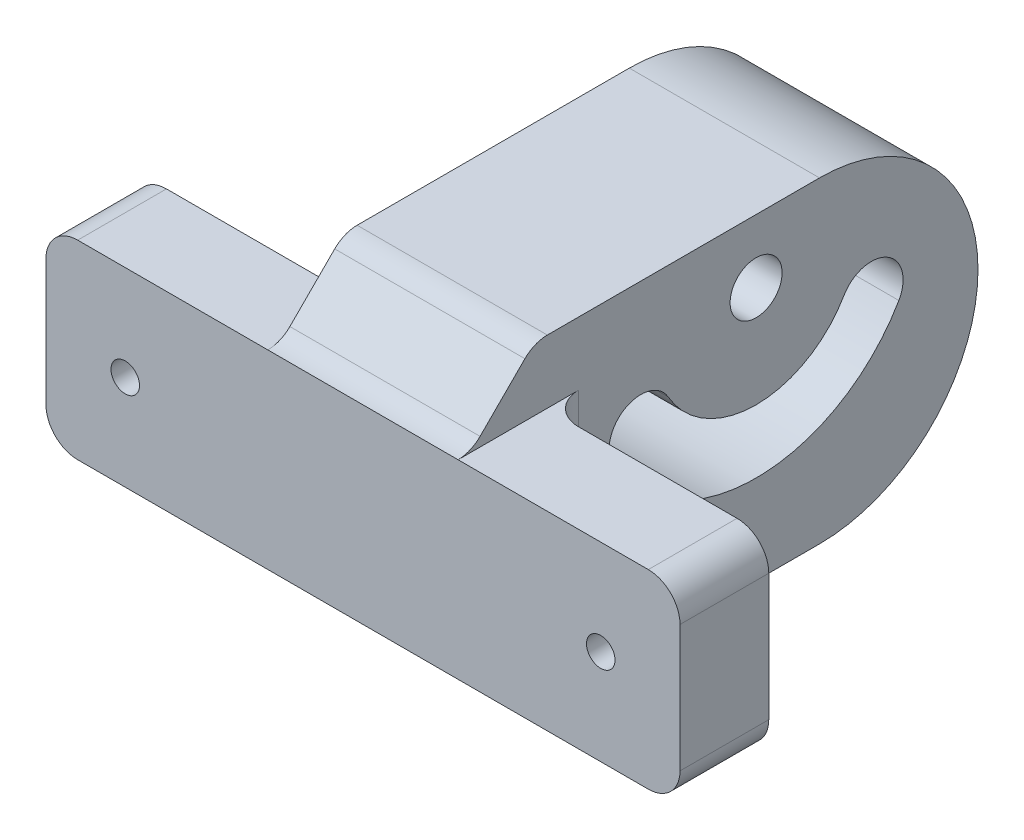
ISO-10303-21;
HEADER;
FILE_DESCRIPTION(('STEP AP214'),'2;1');
FILE_NAME('part.step','',(''),(''),'','','');
FILE_SCHEMA(('AUTOMOTIVE_DESIGN { 1 0 10303 214 1 1 1 1 }'));
ENDSEC;
DATA;
#1=APPLICATION_CONTEXT('core data for automotive mechanical design processes');
#2=APPLICATION_PROTOCOL_DEFINITION('international standard','automotive_design',2000,#1);
#3=PRODUCT_CONTEXT('',#1,'mechanical');
#4=PRODUCT('Part','Part','',(#3));
#5=PRODUCT_RELATED_PRODUCT_CATEGORY('part','',(#4));
#6=PRODUCT_DEFINITION_FORMATION('','',#4);
#7=PRODUCT_DEFINITION_CONTEXT('part definition',#1,'design');
#8=PRODUCT_DEFINITION('design','',#6,#7);
#9=PRODUCT_DEFINITION_SHAPE('','',#8);
#10=(LENGTH_UNIT() NAMED_UNIT(*) SI_UNIT(.MILLI.,.METRE.));
#11=(NAMED_UNIT(*) PLANE_ANGLE_UNIT() SI_UNIT($,.RADIAN.));
#12=(NAMED_UNIT(*) SI_UNIT($,.STERADIAN.) SOLID_ANGLE_UNIT());
#13=UNCERTAINTY_MEASURE_WITH_UNIT(LENGTH_MEASURE(1.E-05),#10,'distance_accuracy_value','');
#14=(GEOMETRIC_REPRESENTATION_CONTEXT(3) GLOBAL_UNCERTAINTY_ASSIGNED_CONTEXT((#13)) GLOBAL_UNIT_ASSIGNED_CONTEXT((#10,
#11,#12)) REPRESENTATION_CONTEXT('',''));
#15=CARTESIAN_POINT('',(0.,0.,0.));
#16=DIRECTION('',(0.,0.,1.));
#17=DIRECTION('',(1.,0.,0.));
#18=AXIS2_PLACEMENT_3D('',#15,#16,#17);
#19=CARTESIAN_POINT('',(50.,-44.,-21.));
#20=DIRECTION('',(0.,1.,0.));
#21=DIRECTION('',(-1.,0.,0.));
#22=AXIS2_PLACEMENT_3D('',#19,#20,#21);
#23=PLANE('',#22);
#24=DIRECTION('',(-1.,0.,0.));
#25=VECTOR('',#24,1.);
#26=CARTESIAN_POINT('',(50.,-44.,-7.));
#27=LINE('',#26,#25);
#28=CARTESIAN_POINT('',(-15.,-44.,-7.));
#29=VERTEX_POINT('',#28);
#30=CARTESIAN_POINT('',(-45.,-44.,-7.));
#31=VERTEX_POINT('',#30);
#32=EDGE_CURVE('E324',#29,#31,#27,.T.);
#33=ORIENTED_EDGE('',*,*,#32,.T.);
#34=DIRECTION('',(0.,0.,1.));
#35=VECTOR('',#34,1.);
#36=CARTESIAN_POINT('',(-45.,-44.,-21.));
#37=LINE('',#36,#35);
#38=CARTESIAN_POINT('',(-45.,-44.,-21.));
#39=VERTEX_POINT('',#38);
#40=EDGE_CURVE('E419',#31,#39,#37,.F.);
#41=ORIENTED_EDGE('',*,*,#40,.T.);
#42=DIRECTION('',(-1.,0.,0.));
#43=VECTOR('',#42,1.);
#44=CARTESIAN_POINT('',(50.,-44.,-21.));
#45=LINE('',#44,#43);
#46=CARTESIAN_POINT('',(-20.,-44.,-21.));
#47=VERTEX_POINT('',#46);
#48=EDGE_CURVE('E311',#47,#39,#45,.T.);
#49=ORIENTED_EDGE('',*,*,#48,.F.);
#50=CARTESIAN_POINT('',(-20.,-44.,-26.));
#51=DIRECTION('',(0.,1.,0.));
#52=DIRECTION('',(-1.,0.,0.));
#53=AXIS2_PLACEMENT_3D('',#50,#51,#52);
#54=CIRCLE('',#53,5.);
#55=CARTESIAN_POINT('',(-15.,-44.,-26.));
#56=VERTEX_POINT('',#55);
#57=EDGE_CURVE('E444',#47,#56,#54,.T.);
#58=ORIENTED_EDGE('',*,*,#57,.T.);
#59=DIRECTION('',(0.,0.,-1.));
#60=VECTOR('',#59,1.);
#61=CARTESIAN_POINT('',(-15.,-44.,-21.));
#62=LINE('',#61,#60);
#63=EDGE_CURVE('E281',#29,#56,#62,.T.);
#64=ORIENTED_EDGE('',*,*,#63,.F.);
#65=EDGE_LOOP('',(#33,#41,#49,#58,#64));
#66=FACE_BOUND('',#65,.T.);
#67=ADVANCED_FACE('F39',(#66),#23,.F.);
#68=CARTESIAN_POINT('',(50.,-14.,-21.));
#69=DIRECTION('',(0.,-1.,0.));
#70=DIRECTION('',(1.,0.,0.));
#71=AXIS2_PLACEMENT_3D('',#68,#69,#70);
#72=PLANE('',#71);
#73=DIRECTION('',(1.,0.,0.));
#74=VECTOR('',#73,1.);
#75=CARTESIAN_POINT('',(50.,-14.,-21.));
#76=LINE('',#75,#74);
#77=CARTESIAN_POINT('',(-45.,-14.,-21.));
#78=VERTEX_POINT('',#77);
#79=CARTESIAN_POINT('',(-20.,-14.,-21.));
#80=VERTEX_POINT('',#79);
#81=EDGE_CURVE('E318',#78,#80,#76,.T.);
#82=ORIENTED_EDGE('',*,*,#81,.F.);
#83=DIRECTION('',(0.,0.,1.));
#84=VECTOR('',#83,1.);
#85=CARTESIAN_POINT('',(-45.,-14.,-21.));
#86=LINE('',#85,#84);
#87=CARTESIAN_POINT('',(-45.,-14.,-7.));
#88=VERTEX_POINT('',#87);
#89=EDGE_CURVE('E408',#78,#88,#86,.T.);
#90=ORIENTED_EDGE('',*,*,#89,.T.);
#91=DIRECTION('',(1.,0.,0.));
#92=VECTOR('',#91,1.);
#93=CARTESIAN_POINT('',(50.,-14.,-7.));
#94=LINE('',#93,#92);
#95=CARTESIAN_POINT('',(-15.,-14.,-7.));
#96=VERTEX_POINT('',#95);
#97=EDGE_CURVE('E312',#88,#96,#94,.T.);
#98=ORIENTED_EDGE('',*,*,#97,.T.);
#99=DIRECTION('',(0.,0.,1.));
#100=VECTOR('',#99,1.);
#101=CARTESIAN_POINT('',(-15.,-14.,-21.));
#102=LINE('',#101,#100);
#103=CARTESIAN_POINT('',(-15.,-14.,-26.));
#104=VERTEX_POINT('',#103);
#105=EDGE_CURVE('E270',#104,#96,#102,.T.);
#106=ORIENTED_EDGE('',*,*,#105,.F.);
#107=CARTESIAN_POINT('',(-20.,-14.,-26.));
#108=DIRECTION('',(0.,-1.,0.));
#109=DIRECTION('',(1.,0.,0.));
#110=AXIS2_PLACEMENT_3D('',#107,#108,#109);
#111=CIRCLE('',#110,5.);
#112=EDGE_CURVE('E447',#104,#80,#111,.T.);
#113=ORIENTED_EDGE('',*,*,#112,.T.);
#114=EDGE_LOOP('',(#82,#90,#98,#106,#113));
#115=FACE_BOUND('',#114,.T.);
#116=ADVANCED_FACE('F539',(#115),#72,.F.);
#117=CARTESIAN_POINT('',(0.,0.,-21.));
#118=DIRECTION('',(0.,0.,-1.));
#119=DIRECTION('',(-1.,0.,0.));
#120=AXIS2_PLACEMENT_3D('',#117,#118,#119);
#121=PLANE('',#120);
#122=CARTESIAN_POINT('',(-37.5,-29.,-21.));
#123=DIRECTION('',(0.,0.,-1.));
#124=DIRECTION('',(-1.,0.,0.));
#125=AXIS2_PLACEMENT_3D('',#122,#123,#124);
#126=CIRCLE('',#125,4.5);
#127=CARTESIAN_POINT('',(-42.,-29.,-21.));
#128=VERTEX_POINT('',#127);
#129=EDGE_CURVE('E295',#128,#128,#126,.T.);
#130=ORIENTED_EDGE('',*,*,#129,.F.);
#131=EDGE_LOOP('',(#130));
#132=FACE_BOUND('',#131,.T.);
#133=ORIENTED_EDGE('',*,*,#48,.T.);
#134=CARTESIAN_POINT('',(-45.,-39.,-21.));
#135=DIRECTION('',(0.,0.,-1.));
#136=DIRECTION('',(-1.,0.,0.));
#137=AXIS2_PLACEMENT_3D('',#134,#135,#136);
#138=CIRCLE('',#137,5.);
#139=CARTESIAN_POINT('',(-50.,-39.,-21.));
#140=VERTEX_POINT('',#139);
#141=EDGE_CURVE('E61',#39,#140,#138,.T.);
#142=ORIENTED_EDGE('',*,*,#141,.T.);
#143=DIRECTION('',(0.,1.,0.));
#144=VECTOR('',#143,1.);
#145=CARTESIAN_POINT('',(-50.,-14.,-21.));
#146=LINE('',#145,#144);
#147=CARTESIAN_POINT('',(-50.,-19.,-21.));
#148=VERTEX_POINT('',#147);
#149=EDGE_CURVE('E315',#140,#148,#146,.T.);
#150=ORIENTED_EDGE('',*,*,#149,.T.);
#151=CARTESIAN_POINT('',(-45.,-19.,-21.));
#152=DIRECTION('',(0.,0.,-1.));
#153=DIRECTION('',(-1.,0.,0.));
#154=AXIS2_PLACEMENT_3D('',#151,#152,#153);
#155=CIRCLE('',#154,5.);
#156=EDGE_CURVE('E431',#148,#78,#155,.T.);
#157=ORIENTED_EDGE('',*,*,#156,.T.);
#158=ORIENTED_EDGE('',*,*,#81,.T.);
#159=DIRECTION('',(0.,-1.,0.));
#160=VECTOR('',#159,1.);
#161=CARTESIAN_POINT('',(-20.,0.,-21.));
#162=LINE('',#161,#160);
#163=EDGE_CURVE('E428',#80,#47,#162,.T.);
#164=ORIENTED_EDGE('',*,*,#163,.T.);
#165=EDGE_LOOP('',(#133,#142,#150,#157,#158,#164));
#166=FACE_BOUND('',#165,.T.);
#167=ADVANCED_FACE('F558',(#132,#166),#121,.T.);
#168=CARTESIAN_POINT('',(-37.5,-29.,-0.636038969321066));
#169=DIRECTION('',(0.,0.,-1.));
#170=DIRECTION('',(-1.,0.,0.));
#171=AXIS2_PLACEMENT_3D('',#168,#169,#170);
#172=CYLINDRICAL_SURFACE('',#171,2.25);
#173=CARTESIAN_POINT('',(-37.5,-29.,-7.));
#174=DIRECTION('',(0.,0.,-1.));
#175=DIRECTION('',(-1.,0.,0.));
#176=AXIS2_PLACEMENT_3D('',#173,#174,#175);
#177=CIRCLE('',#176,2.25);
#178=CARTESIAN_POINT('',(-39.75,-29.,-7.));
#179=VERTEX_POINT('',#178);
#180=EDGE_CURVE('E304',#179,#179,#177,.F.);
#181=ORIENTED_EDGE('',*,*,#180,.T.);
#182=EDGE_LOOP('',(#181));
#183=FACE_BOUND('',#182,.T.);
#184=CARTESIAN_POINT('',(-37.5,-29.,-16.6));
#185=DIRECTION('',(0.,0.,-1.));
#186=DIRECTION('',(-1.,0.,0.));
#187=AXIS2_PLACEMENT_3D('',#184,#185,#186);
#188=CIRCLE('',#187,2.25);
#189=CARTESIAN_POINT('',(-39.75,-29.,-16.6));
#190=VERTEX_POINT('',#189);
#191=EDGE_CURVE('E307',#190,#190,#188,.F.);
#192=ORIENTED_EDGE('',*,*,#191,.F.);
#193=EDGE_LOOP('',(#192));
#194=FACE_BOUND('',#193,.T.);
#195=ADVANCED_FACE('F560',(#183,#194),#172,.F.);
#196=CARTESIAN_POINT('',(37.5,-29.,-0.636038969321066));
#197=DIRECTION('',(0.,0.,-1.));
#198=DIRECTION('',(-1.,0.,0.));
#199=AXIS2_PLACEMENT_3D('',#196,#197,#198);
#200=CYLINDRICAL_SURFACE('',#199,2.25);
#201=CARTESIAN_POINT('',(37.5,-29.,-7.));
#202=DIRECTION('',(0.,0.,-1.));
#203=DIRECTION('',(-1.,0.,0.));
#204=AXIS2_PLACEMENT_3D('',#201,#202,#203);
#205=CIRCLE('',#204,2.25);
#206=CARTESIAN_POINT('',(35.25,-29.,-7.));
#207=VERTEX_POINT('',#206);
#208=EDGE_CURVE('E300',#207,#207,#205,.F.);
#209=ORIENTED_EDGE('',*,*,#208,.T.);
#210=EDGE_LOOP('',(#209));
#211=FACE_BOUND('',#210,.T.);
#212=CARTESIAN_POINT('',(37.5,-29.,-16.6));
#213=DIRECTION('',(0.,0.,-1.));
#214=DIRECTION('',(-1.,0.,0.));
#215=AXIS2_PLACEMENT_3D('',#212,#213,#214);
#216=CIRCLE('',#215,2.25);
#217=CARTESIAN_POINT('',(35.25,-29.,-16.6));
#218=VERTEX_POINT('',#217);
#219=EDGE_CURVE('E291',#218,#218,#216,.F.);
#220=ORIENTED_EDGE('',*,*,#219,.F.);
#221=EDGE_LOOP('',(#220));
#222=FACE_BOUND('',#221,.T.);
#223=ADVANCED_FACE('F568',(#211,#222),#200,.F.);
#224=CARTESIAN_POINT('',(50.,-14.,-21.));
#225=DIRECTION('',(-1.,0.,0.));
#226=DIRECTION('',(0.,-1.,0.));
#227=AXIS2_PLACEMENT_3D('',#224,#225,#226);
#228=PLANE('',#227);
#229=DIRECTION('',(0.,-1.,0.));
#230=VECTOR('',#229,1.);
#231=CARTESIAN_POINT('',(50.,-14.,-21.));
#232=LINE('',#231,#230);
#233=CARTESIAN_POINT('',(50.,-19.,-21.));
#234=VERTEX_POINT('',#233);
#235=CARTESIAN_POINT('',(50.,-39.,-21.));
#236=VERTEX_POINT('',#235);
#237=EDGE_CURVE('E308',#234,#236,#232,.T.);
#238=ORIENTED_EDGE('',*,*,#237,.F.);
#239=DIRECTION('',(0.,0.,1.));
#240=VECTOR('',#239,1.);
#241=CARTESIAN_POINT('',(50.,-19.,-21.));
#242=LINE('',#241,#240);
#243=CARTESIAN_POINT('',(50.,-19.,-7.));
#244=VERTEX_POINT('',#243);
#245=EDGE_CURVE('E397',#234,#244,#242,.T.);
#246=ORIENTED_EDGE('',*,*,#245,.T.);
#247=DIRECTION('',(0.,-1.,0.));
#248=VECTOR('',#247,1.);
#249=CARTESIAN_POINT('',(50.,-14.,-7.));
#250=LINE('',#249,#248);
#251=CARTESIAN_POINT('',(50.,-39.,-7.));
#252=VERTEX_POINT('',#251);
#253=EDGE_CURVE('E303',#244,#252,#250,.T.);
#254=ORIENTED_EDGE('',*,*,#253,.T.);
#255=DIRECTION('',(0.,0.,1.));
#256=VECTOR('',#255,1.);
#257=CARTESIAN_POINT('',(50.,-39.,-21.));
#258=LINE('',#257,#256);
#259=EDGE_CURVE('E395',#252,#236,#258,.F.);
#260=ORIENTED_EDGE('',*,*,#259,.T.);
#261=EDGE_LOOP('',(#238,#246,#254,#260));
#262=FACE_BOUND('',#261,.T.);
#263=ADVANCED_FACE('F475',(#262),#228,.F.);
#264=CARTESIAN_POINT('',(45.,-44.,-21.));
#265=VERTEX_POINT('',#264);
#266=CARTESIAN_POINT('',(20.,-44.,-21.));
#267=VERTEX_POINT('',#266);
#268=EDGE_CURVE('E314',#265,#267,#45,.T.);
#269=ORIENTED_EDGE('',*,*,#268,.F.);
#270=DIRECTION('',(0.,0.,1.));
#271=VECTOR('',#270,1.);
#272=CARTESIAN_POINT('',(45.,-44.,-21.));
#273=LINE('',#272,#271);
#274=CARTESIAN_POINT('',(45.,-44.,-7.));
#275=VERTEX_POINT('',#274);
#276=EDGE_CURVE('E421',#265,#275,#273,.T.);
#277=ORIENTED_EDGE('',*,*,#276,.T.);
#278=CARTESIAN_POINT('',(15.,-44.,-7.));
#279=VERTEX_POINT('',#278);
#280=EDGE_CURVE('E328',#275,#279,#27,.T.);
#281=ORIENTED_EDGE('',*,*,#280,.T.);
#282=DIRECTION('',(0.,0.,-1.));
#283=VECTOR('',#282,1.);
#284=CARTESIAN_POINT('',(15.,-44.,-21.));
#285=LINE('',#284,#283);
#286=CARTESIAN_POINT('',(15.,-44.,-26.));
#287=VERTEX_POINT('',#286);
#288=EDGE_CURVE('E285',#279,#287,#285,.T.);
#289=ORIENTED_EDGE('',*,*,#288,.T.);
#290=CARTESIAN_POINT('',(20.,-44.,-26.));
#291=DIRECTION('',(0.,1.,0.));
#292=DIRECTION('',(-1.,0.,0.));
#293=AXIS2_PLACEMENT_3D('',#290,#291,#292);
#294=CIRCLE('',#293,5.);
#295=EDGE_CURVE('E47',#287,#267,#294,.T.);
#296=ORIENTED_EDGE('',*,*,#295,.T.);
#297=EDGE_LOOP('',(#269,#277,#281,#289,#296));
#298=FACE_BOUND('',#297,.T.);
#299=ADVANCED_FACE('F452',(#298),#23,.F.);
#300=CARTESIAN_POINT('',(-50.,-14.,-21.));
#301=DIRECTION('',(1.,0.,0.));
#302=DIRECTION('',(0.,0.,-1.));
#303=AXIS2_PLACEMENT_3D('',#300,#301,#302);
#304=PLANE('',#303);
#305=ORIENTED_EDGE('',*,*,#149,.F.);
#306=DIRECTION('',(0.,0.,1.));
#307=VECTOR('',#306,1.);
#308=CARTESIAN_POINT('',(-50.,-39.,-21.));
#309=LINE('',#308,#307);
#310=CARTESIAN_POINT('',(-50.,-39.,-7.));
#311=VERTEX_POINT('',#310);
#312=EDGE_CURVE('E425',#140,#311,#309,.T.);
#313=ORIENTED_EDGE('',*,*,#312,.T.);
#314=DIRECTION('',(0.,1.,0.));
#315=VECTOR('',#314,1.);
#316=CARTESIAN_POINT('',(-50.,-14.,-7.));
#317=LINE('',#316,#315);
#318=CARTESIAN_POINT('',(-50.,-19.,-7.));
#319=VERTEX_POINT('',#318);
#320=EDGE_CURVE('E329',#311,#319,#317,.T.);
#321=ORIENTED_EDGE('',*,*,#320,.T.);
#322=DIRECTION('',(0.,0.,1.));
#323=VECTOR('',#322,1.);
#324=CARTESIAN_POINT('',(-50.,-19.,-21.));
#325=LINE('',#324,#323);
#326=EDGE_CURVE('E54',#319,#148,#325,.F.);
#327=ORIENTED_EDGE('',*,*,#326,.T.);
#328=EDGE_LOOP('',(#305,#313,#321,#327));
#329=FACE_BOUND('',#328,.T.);
#330=ADVANCED_FACE('F545',(#329),#304,.F.);
#331=CARTESIAN_POINT('',(15.,-14.,-7.));
#332=VERTEX_POINT('',#331);
#333=CARTESIAN_POINT('',(45.,-14.,-7.));
#334=VERTEX_POINT('',#333);
#335=EDGE_CURVE('E331',#332,#334,#94,.T.);
#336=ORIENTED_EDGE('',*,*,#335,.T.);
#337=DIRECTION('',(0.,0.,1.));
#338=VECTOR('',#337,1.);
#339=CARTESIAN_POINT('',(45.,-14.,-21.));
#340=LINE('',#339,#338);
#341=CARTESIAN_POINT('',(45.,-14.,-21.));
#342=VERTEX_POINT('',#341);
#343=EDGE_CURVE('E411',#334,#342,#340,.F.);
#344=ORIENTED_EDGE('',*,*,#343,.T.);
#345=CARTESIAN_POINT('',(20.,-14.,-21.));
#346=VERTEX_POINT('',#345);
#347=EDGE_CURVE('E317',#346,#342,#76,.T.);
#348=ORIENTED_EDGE('',*,*,#347,.F.);
#349=CARTESIAN_POINT('',(20.,-14.,-26.));
#350=DIRECTION('',(0.,-1.,0.));
#351=DIRECTION('',(1.,0.,0.));
#352=AXIS2_PLACEMENT_3D('',#349,#350,#351);
#353=CIRCLE('',#352,5.);
#354=CARTESIAN_POINT('',(15.,-14.,-26.));
#355=VERTEX_POINT('',#354);
#356=EDGE_CURVE('E11',#346,#355,#353,.T.);
#357=ORIENTED_EDGE('',*,*,#356,.T.);
#358=DIRECTION('',(0.,0.,1.));
#359=VECTOR('',#358,1.);
#360=CARTESIAN_POINT('',(15.,-14.,-21.));
#361=LINE('',#360,#359);
#362=EDGE_CURVE('E283',#355,#332,#361,.T.);
#363=ORIENTED_EDGE('',*,*,#362,.T.);
#364=EDGE_LOOP('',(#336,#344,#348,#357,#363));
#365=FACE_BOUND('',#364,.T.);
#366=ADVANCED_FACE('F466',(#365),#72,.F.);
#367=ORIENTED_EDGE('',*,*,#347,.T.);
#368=CARTESIAN_POINT('',(45.,-19.,-21.));
#369=DIRECTION('',(0.,0.,-1.));
#370=DIRECTION('',(-1.,0.,0.));
#371=AXIS2_PLACEMENT_3D('',#368,#369,#370);
#372=CIRCLE('',#371,5.);
#373=EDGE_CURVE('E417',#342,#234,#372,.T.);
#374=ORIENTED_EDGE('',*,*,#373,.T.);
#375=ORIENTED_EDGE('',*,*,#237,.T.);
#376=CARTESIAN_POINT('',(45.,-39.,-21.));
#377=DIRECTION('',(0.,0.,-1.));
#378=DIRECTION('',(-1.,0.,0.));
#379=AXIS2_PLACEMENT_3D('',#376,#377,#378);
#380=CIRCLE('',#379,5.);
#381=EDGE_CURVE('E415',#236,#265,#380,.T.);
#382=ORIENTED_EDGE('',*,*,#381,.T.);
#383=ORIENTED_EDGE('',*,*,#268,.T.);
#384=DIRECTION('',(0.,-1.,0.));
#385=VECTOR('',#384,1.);
#386=CARTESIAN_POINT('',(20.,-14.,-21.));
#387=LINE('',#386,#385);
#388=EDGE_CURVE('E413',#267,#346,#387,.F.);
#389=ORIENTED_EDGE('',*,*,#388,.T.);
#390=EDGE_LOOP('',(#367,#374,#375,#382,#383,#389));
#391=FACE_BOUND('',#390,.T.);
#392=CARTESIAN_POINT('',(37.5,-29.,-21.));
#393=DIRECTION('',(0.,0.,-1.));
#394=DIRECTION('',(-1.,0.,0.));
#395=AXIS2_PLACEMENT_3D('',#392,#393,#394);
#396=CIRCLE('',#395,4.5);
#397=CARTESIAN_POINT('',(33.,-29.,-21.));
#398=VERTEX_POINT('',#397);
#399=EDGE_CURVE('E292',#398,#398,#396,.T.);
#400=ORIENTED_EDGE('',*,*,#399,.F.);
#401=EDGE_LOOP('',(#400));
#402=FACE_BOUND('',#401,.T.);
#403=ADVANCED_FACE('F460',(#391,#402),#121,.T.);
#404=CARTESIAN_POINT('',(0.,0.,-7.));
#405=DIRECTION('',(0.,0.,-1.));
#406=DIRECTION('',(-1.,0.,0.));
#407=AXIS2_PLACEMENT_3D('',#404,#405,#406);
#408=PLANE('',#407);
#409=ORIENTED_EDGE('',*,*,#208,.F.);
#410=EDGE_LOOP('',(#409));
#411=FACE_BOUND('',#410,.T.);
#412=ORIENTED_EDGE('',*,*,#180,.F.);
#413=EDGE_LOOP('',(#412));
#414=FACE_BOUND('',#413,.T.);
#415=ORIENTED_EDGE('',*,*,#253,.F.);
#416=CARTESIAN_POINT('',(45.,-19.,-7.));
#417=DIRECTION('',(0.,0.,-1.));
#418=DIRECTION('',(-1.,0.,0.));
#419=AXIS2_PLACEMENT_3D('',#416,#417,#418);
#420=CIRCLE('',#419,5.);
#421=EDGE_CURVE('E406',#244,#334,#420,.F.);
#422=ORIENTED_EDGE('',*,*,#421,.T.);
#423=ORIENTED_EDGE('',*,*,#335,.F.);
#424=EDGE_CURVE('E334',#96,#332,#94,.T.);
#425=ORIENTED_EDGE('',*,*,#424,.F.);
#426=ORIENTED_EDGE('',*,*,#97,.F.);
#427=CARTESIAN_POINT('',(-45.,-19.,-7.));
#428=DIRECTION('',(0.,0.,-1.));
#429=DIRECTION('',(-1.,0.,0.));
#430=AXIS2_PLACEMENT_3D('',#427,#428,#429);
#431=CIRCLE('',#430,5.);
#432=EDGE_CURVE('E400',#88,#319,#431,.F.);
#433=ORIENTED_EDGE('',*,*,#432,.T.);
#434=ORIENTED_EDGE('',*,*,#320,.F.);
#435=CARTESIAN_POINT('',(-45.,-39.,-7.));
#436=DIRECTION('',(0.,0.,-1.));
#437=DIRECTION('',(-1.,0.,0.));
#438=AXIS2_PLACEMENT_3D('',#435,#436,#437);
#439=CIRCLE('',#438,5.);
#440=EDGE_CURVE('E402',#311,#31,#439,.F.);
#441=ORIENTED_EDGE('',*,*,#440,.T.);
#442=ORIENTED_EDGE('',*,*,#32,.F.);
#443=EDGE_CURVE('E327',#279,#29,#27,.T.);
#444=ORIENTED_EDGE('',*,*,#443,.F.);
#445=ORIENTED_EDGE('',*,*,#280,.F.);
#446=CARTESIAN_POINT('',(45.,-39.,-7.));
#447=DIRECTION('',(0.,0.,-1.));
#448=DIRECTION('',(-1.,0.,0.));
#449=AXIS2_PLACEMENT_3D('',#446,#447,#448);
#450=CIRCLE('',#449,5.);
#451=EDGE_CURVE('E404',#275,#252,#450,.F.);
#452=ORIENTED_EDGE('',*,*,#451,.T.);
#453=EDGE_LOOP('',(#415,#422,#423,#425,#426,#433,#434,#441,#442,#444,#445,#452));
#454=FACE_BOUND('',#453,.T.);
#455=ADVANCED_FACE('F478',(#411,#414,#454),#408,.F.);
#456=CARTESIAN_POINT('',(37.5,-29.,-16.6));
#457=DIRECTION('',(0.,0.,-1.));
#458=DIRECTION('',(-1.,0.,0.));
#459=AXIS2_PLACEMENT_3D('',#456,#457,#458);
#460=PLANE('',#459);
#461=CARTESIAN_POINT('',(37.5,-29.,-16.6));
#462=DIRECTION('',(0.,0.,-1.));
#463=DIRECTION('',(-1.,0.,0.));
#464=AXIS2_PLACEMENT_3D('',#461,#462,#463);
#465=CIRCLE('',#464,4.5);
#466=CARTESIAN_POINT('',(33.,-29.,-16.6));
#467=VERTEX_POINT('',#466);
#468=EDGE_CURVE('E288',#467,#467,#465,.T.);
#469=ORIENTED_EDGE('',*,*,#468,.T.);
#470=EDGE_LOOP('',(#469));
#471=FACE_BOUND('',#470,.T.);
#472=ORIENTED_EDGE('',*,*,#219,.T.);
#473=EDGE_LOOP('',(#472));
#474=FACE_BOUND('',#473,.T.);
#475=ADVANCED_FACE('F820',(#471,#474),#460,.T.);
#476=CARTESIAN_POINT('',(37.5,-29.,-16.6));
#477=DIRECTION('',(0.,0.,-1.));
#478=DIRECTION('',(-1.,0.,0.));
#479=AXIS2_PLACEMENT_3D('',#476,#477,#478);
#480=CYLINDRICAL_SURFACE('',#479,4.5);
#481=ORIENTED_EDGE('',*,*,#468,.F.);
#482=EDGE_LOOP('',(#481));
#483=FACE_BOUND('',#482,.T.);
#484=ORIENTED_EDGE('',*,*,#399,.T.);
#485=EDGE_LOOP('',(#484));
#486=FACE_BOUND('',#485,.T.);
#487=ADVANCED_FACE('F810',(#483,#486),#480,.F.);
#488=CARTESIAN_POINT('',(-37.5,-29.,-16.6));
#489=DIRECTION('',(0.,0.,-1.));
#490=DIRECTION('',(-1.,0.,0.));
#491=AXIS2_PLACEMENT_3D('',#488,#489,#490);
#492=PLANE('',#491);
#493=CARTESIAN_POINT('',(-37.5,-29.,-16.6));
#494=DIRECTION('',(0.,0.,-1.));
#495=DIRECTION('',(-1.,0.,0.));
#496=AXIS2_PLACEMENT_3D('',#493,#494,#495);
#497=CIRCLE('',#496,4.5);
#498=CARTESIAN_POINT('',(-42.,-29.,-16.6));
#499=VERTEX_POINT('',#498);
#500=EDGE_CURVE('E287',#499,#499,#497,.T.);
#501=ORIENTED_EDGE('',*,*,#500,.T.);
#502=EDGE_LOOP('',(#501));
#503=FACE_BOUND('',#502,.T.);
#504=ORIENTED_EDGE('',*,*,#191,.T.);
#505=EDGE_LOOP('',(#504));
#506=FACE_BOUND('',#505,.T.);
#507=ADVANCED_FACE('F800',(#503,#506),#492,.T.);
#508=CARTESIAN_POINT('',(-37.5,-29.,-16.6));
#509=DIRECTION('',(0.,0.,-1.));
#510=DIRECTION('',(-1.,0.,0.));
#511=AXIS2_PLACEMENT_3D('',#508,#509,#510);
#512=CYLINDRICAL_SURFACE('',#511,4.5);
#513=ORIENTED_EDGE('',*,*,#500,.F.);
#514=EDGE_LOOP('',(#513));
#515=FACE_BOUND('',#514,.T.);
#516=ORIENTED_EDGE('',*,*,#129,.T.);
#517=EDGE_LOOP('',(#516));
#518=FACE_BOUND('',#517,.T.);
#519=ADVANCED_FACE('F787',(#515,#518),#512,.F.);
#520=CARTESIAN_POINT('',(15.,0.,0.));
#521=DIRECTION('',(1.,0.,0.));
#522=DIRECTION('',(0.,0.,-1.));
#523=AXIS2_PLACEMENT_3D('',#520,#521,#522);
#524=PLANE('',#523);
#525=CARTESIAN_POINT('',(15.,-24.5000000000001,-35.813466520527));
#526=DIRECTION('',(1.,0.,0.));
#527=DIRECTION('',(0.,0.,-1.));
#528=AXIS2_PLACEMENT_3D('',#525,#526,#527);
#529=CIRCLE('',#528,5.00000000000001);
#530=CARTESIAN_POINT('',(15.,-22.0000000000001,-40.1435935394491));
#531=VERTEX_POINT('',#530);
#532=CARTESIAN_POINT('',(15.,-27.0000000000001,-31.4833395016047));
#533=VERTEX_POINT('',#532);
#534=EDGE_CURVE('E247',#531,#533,#529,.T.);
#535=ORIENTED_EDGE('',*,*,#534,.F.);
#536=CARTESIAN_POINT('',(15.,-14.,-54.0000000000001));
#537=DIRECTION('',(1.,0.,0.));
#538=DIRECTION('',(0.,0.,-1.));
#539=AXIS2_PLACEMENT_3D('',#536,#537,#538);
#540=CIRCLE('',#539,16.);
#541=CARTESIAN_POINT('',(15.,-21.9999999999999,-67.8564064605511));
#542=VERTEX_POINT('',#541);
#543=EDGE_CURVE('E245',#542,#531,#540,.F.);
#544=ORIENTED_EDGE('',*,*,#543,.F.);
#545=CARTESIAN_POINT('',(15.,-24.5,-72.1865334794733));
#546=DIRECTION('',(1.,0.,0.));
#547=DIRECTION('',(0.,0.,-1.));
#548=AXIS2_PLACEMENT_3D('',#545,#546,#547);
#549=CIRCLE('',#548,5.);
#550=CARTESIAN_POINT('',(15.,-27.,-76.5166604983956));
#551=VERTEX_POINT('',#550);
#552=EDGE_CURVE('E230',#551,#542,#549,.T.);
#553=ORIENTED_EDGE('',*,*,#552,.F.);
#554=CARTESIAN_POINT('',(15.,-14.,-54.0000000000001));
#555=DIRECTION('',(1.,0.,0.));
#556=DIRECTION('',(0.,0.,-1.));
#557=AXIS2_PLACEMENT_3D('',#554,#555,#556);
#558=CIRCLE('',#557,26.);
#559=EDGE_CURVE('E219',#533,#551,#558,.T.);
#560=ORIENTED_EDGE('',*,*,#559,.F.);
#561=EDGE_LOOP('',(#535,#544,#553,#560));
#562=FACE_BOUND('',#561,.T.);
#563=CARTESIAN_POINT('',(15.,-14.,-54.0000000000001));
#564=DIRECTION('',(1.,0.,0.));
#565=DIRECTION('',(0.,0.,-1.));
#566=AXIS2_PLACEMENT_3D('',#563,#564,#565);
#567=CIRCLE('',#566,4.1);
#568=CARTESIAN_POINT('',(15.,-14.,-58.1000000000001));
#569=VERTEX_POINT('',#568);
#570=EDGE_CURVE('E253',#569,#569,#567,.T.);
#571=ORIENTED_EDGE('',*,*,#570,.F.);
#572=EDGE_LOOP('',(#571));
#573=FACE_BOUND('',#572,.T.);
#574=DIRECTION('',(0.,-0.707106781186544,-0.707106781186551));
#575=VECTOR('',#574,1.);
#576=CARTESIAN_POINT('',(15.,-44.,-9.));
#577=LINE('',#576,#575);
#578=CARTESIAN_POINT('',(15.,-45.4639536951545,-10.4639536951545));
#579=VERTEX_POINT('',#578);
#580=CARTESIAN_POINT('',(15.,-52.5355339059328,-17.5355339059328));
#581=VERTEX_POINT('',#580);
#582=EDGE_CURVE('E258',#579,#581,#577,.T.);
#583=ORIENTED_EDGE('',*,*,#582,.T.);
#584=CARTESIAN_POINT('',(15.,-49.,-21.0710678118656));
#585=DIRECTION('',(1.,0.,0.));
#586=DIRECTION('',(0.,0.,-1.));
#587=AXIS2_PLACEMENT_3D('',#584,#585,#586);
#588=CIRCLE('',#587,5.);
#589=CARTESIAN_POINT('',(15.,-54.,-21.0710678118656));
#590=VERTEX_POINT('',#589);
#591=EDGE_CURVE('E386',#581,#590,#588,.T.);
#592=ORIENTED_EDGE('',*,*,#591,.T.);
#593=DIRECTION('',(0.,0.,-1.));
#594=VECTOR('',#593,1.);
#595=CARTESIAN_POINT('',(15.,-54.,-19.0000000000001));
#596=LINE('',#595,#594);
#597=CARTESIAN_POINT('',(15.,-54.,-64.0000000000001));
#598=VERTEX_POINT('',#597);
#599=EDGE_CURVE('E261',#590,#598,#596,.T.);
#600=ORIENTED_EDGE('',*,*,#599,.T.);
#601=CARTESIAN_POINT('',(15.,-29.,-64.0000000000001));
#602=DIRECTION('',(1.,0.,0.));
#603=DIRECTION('',(0.,0.,-1.));
#604=AXIS2_PLACEMENT_3D('',#601,#602,#603);
#605=CIRCLE('',#604,25.);
#606=CARTESIAN_POINT('',(15.,-29.,-89.0000000000001));
#607=VERTEX_POINT('',#606);
#608=EDGE_CURVE('E348',#598,#607,#605,.T.);
#609=ORIENTED_EDGE('',*,*,#608,.T.);
#610=CARTESIAN_POINT('',(15.,-29.,-64.0000000000001));
#611=DIRECTION('',(1.,0.,0.));
#612=DIRECTION('',(0.,0.,-1.));
#613=AXIS2_PLACEMENT_3D('',#610,#611,#612);
#614=CIRCLE('',#613,25.);
#615=CARTESIAN_POINT('',(15.,-4.00000000000002,-64.0000000000001));
#616=VERTEX_POINT('',#615);
#617=EDGE_CURVE('E350',#607,#616,#614,.T.);
#618=ORIENTED_EDGE('',*,*,#617,.T.);
#619=DIRECTION('',(0.,0.,1.));
#620=VECTOR('',#619,1.);
#621=CARTESIAN_POINT('',(15.,-4.00000000000001,-19.0000000000001));
#622=LINE('',#621,#620);
#623=CARTESIAN_POINT('',(15.,-4.00000000000001,-21.0710678118656));
#624=VERTEX_POINT('',#623);
#625=EDGE_CURVE('E264',#616,#624,#622,.T.);
#626=ORIENTED_EDGE('',*,*,#625,.T.);
#627=CARTESIAN_POINT('',(15.,-9.00000000000001,-21.0710678118656));
#628=DIRECTION('',(1.,0.,0.));
#629=DIRECTION('',(0.,0.,-1.));
#630=AXIS2_PLACEMENT_3D('',#627,#628,#629);
#631=CIRCLE('',#630,5.);
#632=CARTESIAN_POINT('',(15.,-5.46446609406726,-17.5355339059328));
#633=VERTEX_POINT('',#632);
#634=EDGE_CURVE('E384',#624,#633,#631,.T.);
#635=ORIENTED_EDGE('',*,*,#634,.T.);
#636=DIRECTION('',(0.,-0.707106781186544,0.707106781186551));
#637=VECTOR('',#636,1.);
#638=CARTESIAN_POINT('',(15.,-14.,-9.));
#639=LINE('',#638,#637);
#640=CARTESIAN_POINT('',(15.,-12.5360463048455,-10.4639536951545));
#641=VERTEX_POINT('',#640);
#642=EDGE_CURVE('E267',#633,#641,#639,.T.);
#643=ORIENTED_EDGE('',*,*,#642,.T.);
#644=CARTESIAN_POINT('',(15.,-9.00051239891278,-6.92841978922177));
#645=DIRECTION('',(1.,0.,0.));
#646=DIRECTION('',(0.,0.,-1.));
#647=AXIS2_PLACEMENT_3D('',#644,#645,#646);
#648=CIRCLE('',#647,5.);
#649=EDGE_CURVE('E436',#641,#332,#648,.F.);
#650=ORIENTED_EDGE('',*,*,#649,.T.);
#651=ORIENTED_EDGE('',*,*,#362,.F.);
#652=DIRECTION('',(0.,-1.,0.));
#653=VECTOR('',#652,1.);
#654=CARTESIAN_POINT('',(15.,-44.,-26.));
#655=LINE('',#654,#653);
#656=EDGE_CURVE('E381',#355,#287,#655,.T.);
#657=ORIENTED_EDGE('',*,*,#656,.T.);
#658=ORIENTED_EDGE('',*,*,#288,.F.);
#659=CARTESIAN_POINT('',(15.,-48.9994876010873,-6.92841978922177));
#660=DIRECTION('',(1.,0.,0.));
#661=DIRECTION('',(0.,0.,-1.));
#662=AXIS2_PLACEMENT_3D('',#659,#660,#661);
#663=CIRCLE('',#662,5.);
#664=EDGE_CURVE('E442',#279,#579,#663,.F.);
#665=ORIENTED_EDGE('',*,*,#664,.T.);
#666=EDGE_LOOP('',(#583,#592,#600,#609,#618,#626,#635,#643,#650,#651,#657,#658,#665));
#667=FACE_BOUND('',#666,.T.);
#668=ADVANCED_FACE('F243',(#562,#573,#667),#524,.T.);
#669=CARTESIAN_POINT('',(-15.,0.,0.));
#670=DIRECTION('',(1.,0.,0.));
#671=DIRECTION('',(0.,0.,-1.));
#672=AXIS2_PLACEMENT_3D('',#669,#670,#671);
#673=PLANE('',#672);
#674=CARTESIAN_POINT('',(-15.,-14.,-54.0000000000001));
#675=DIRECTION('',(1.,0.,0.));
#676=DIRECTION('',(0.,0.,-1.));
#677=AXIS2_PLACEMENT_3D('',#674,#675,#676);
#678=CIRCLE('',#677,16.);
#679=CARTESIAN_POINT('',(-15.,-21.9999999999999,-67.8564064605511));
#680=VERTEX_POINT('',#679);
#681=CARTESIAN_POINT('',(-15.,-22.0000000000001,-40.1435935394491));
#682=VERTEX_POINT('',#681);
#683=EDGE_CURVE('E360',#680,#682,#678,.F.);
#684=ORIENTED_EDGE('',*,*,#683,.T.);
#685=CARTESIAN_POINT('',(-15.,-24.5000000000001,-35.813466520527));
#686=DIRECTION('',(1.,0.,0.));
#687=DIRECTION('',(0.,0.,-1.));
#688=AXIS2_PLACEMENT_3D('',#685,#686,#687);
#689=CIRCLE('',#688,5.00000000000001);
#690=CARTESIAN_POINT('',(-15.,-27.0000000000001,-31.4833395016047));
#691=VERTEX_POINT('',#690);
#692=EDGE_CURVE('E363',#682,#691,#689,.T.);
#693=ORIENTED_EDGE('',*,*,#692,.T.);
#694=CARTESIAN_POINT('',(-15.,-14.,-54.0000000000001));
#695=DIRECTION('',(1.,0.,0.));
#696=DIRECTION('',(0.,0.,-1.));
#697=AXIS2_PLACEMENT_3D('',#694,#695,#696);
#698=CIRCLE('',#697,26.);
#699=CARTESIAN_POINT('',(-15.,-27.,-76.5166604983956));
#700=VERTEX_POINT('',#699);
#701=EDGE_CURVE('E355',#691,#700,#698,.T.);
#702=ORIENTED_EDGE('',*,*,#701,.T.);
#703=CARTESIAN_POINT('',(-15.,-24.5,-72.1865334794733));
#704=DIRECTION('',(1.,0.,0.));
#705=DIRECTION('',(0.,0.,-1.));
#706=AXIS2_PLACEMENT_3D('',#703,#704,#705);
#707=CIRCLE('',#706,5.);
#708=EDGE_CURVE('E238',#700,#680,#707,.T.);
#709=ORIENTED_EDGE('',*,*,#708,.T.);
#710=EDGE_LOOP('',(#684,#693,#702,#709));
#711=FACE_BOUND('',#710,.T.);
#712=CARTESIAN_POINT('',(-15.,-14.,-54.0000000000001));
#713=DIRECTION('',(1.,0.,0.));
#714=DIRECTION('',(0.,0.,-1.));
#715=AXIS2_PLACEMENT_3D('',#712,#713,#714);
#716=CIRCLE('',#715,4.1);
#717=CARTESIAN_POINT('',(-15.,-14.,-58.1000000000001));
#718=VERTEX_POINT('',#717);
#719=EDGE_CURVE('E257',#718,#718,#716,.T.);
#720=ORIENTED_EDGE('',*,*,#719,.T.);
#721=EDGE_LOOP('',(#720));
#722=FACE_BOUND('',#721,.T.);
#723=DIRECTION('',(0.,0.,-1.));
#724=VECTOR('',#723,1.);
#725=CARTESIAN_POINT('',(-15.,-54.,-19.0000000000001));
#726=LINE('',#725,#724);
#727=CARTESIAN_POINT('',(-15.,-54.,-21.0710678118656));
#728=VERTEX_POINT('',#727);
#729=CARTESIAN_POINT('',(-15.,-54.,-64.0000000000001));
#730=VERTEX_POINT('',#729);
#731=EDGE_CURVE('E273',#728,#730,#726,.T.);
#732=ORIENTED_EDGE('',*,*,#731,.F.);
#733=CARTESIAN_POINT('',(-15.,-49.,-21.0710678118656));
#734=DIRECTION('',(1.,0.,0.));
#735=DIRECTION('',(0.,0.,-1.));
#736=AXIS2_PLACEMENT_3D('',#733,#734,#735);
#737=CIRCLE('',#736,5.);
#738=CARTESIAN_POINT('',(-15.,-52.5355339059328,-17.5355339059328));
#739=VERTEX_POINT('',#738);
#740=EDGE_CURVE('E374',#728,#739,#737,.F.);
#741=ORIENTED_EDGE('',*,*,#740,.T.);
#742=DIRECTION('',(0.,-0.707106781186544,-0.707106781186551));
#743=VECTOR('',#742,1.);
#744=CARTESIAN_POINT('',(-15.,-44.,-9.));
#745=LINE('',#744,#743);
#746=CARTESIAN_POINT('',(-15.,-45.4639536951545,-10.4639536951545));
#747=VERTEX_POINT('',#746);
#748=EDGE_CURVE('E256',#747,#739,#745,.T.);
#749=ORIENTED_EDGE('',*,*,#748,.F.);
#750=CARTESIAN_POINT('',(-15.,-48.9994876010872,-6.92841978922177));
#751=DIRECTION('',(1.,0.,0.));
#752=DIRECTION('',(0.,0.,-1.));
#753=AXIS2_PLACEMENT_3D('',#750,#751,#752);
#754=CIRCLE('',#753,5.);
#755=EDGE_CURVE('E439',#747,#29,#754,.T.);
#756=ORIENTED_EDGE('',*,*,#755,.T.);
#757=ORIENTED_EDGE('',*,*,#63,.T.);
#758=DIRECTION('',(0.,-1.,0.));
#759=VECTOR('',#758,1.);
#760=CARTESIAN_POINT('',(-15.,0.,-26.));
#761=LINE('',#760,#759);
#762=EDGE_CURVE('E369',#56,#104,#761,.F.);
#763=ORIENTED_EDGE('',*,*,#762,.T.);
#764=ORIENTED_EDGE('',*,*,#105,.T.);
#765=CARTESIAN_POINT('',(-15.,-9.00051239891277,-6.92841978922177));
#766=DIRECTION('',(1.,0.,0.));
#767=DIRECTION('',(0.,0.,-1.));
#768=AXIS2_PLACEMENT_3D('',#765,#766,#767);
#769=CIRCLE('',#768,5.);
#770=CARTESIAN_POINT('',(-15.,-12.5360463048455,-10.4639536951545));
#771=VERTEX_POINT('',#770);
#772=EDGE_CURVE('E434',#96,#771,#769,.T.);
#773=ORIENTED_EDGE('',*,*,#772,.T.);
#774=DIRECTION('',(0.,-0.707106781186544,0.707106781186551));
#775=VECTOR('',#774,1.);
#776=CARTESIAN_POINT('',(-15.,-14.,-9.));
#777=LINE('',#776,#775);
#778=CARTESIAN_POINT('',(-15.,-5.46446609406726,-17.5355339059328));
#779=VERTEX_POINT('',#778);
#780=EDGE_CURVE('E262',#779,#771,#777,.T.);
#781=ORIENTED_EDGE('',*,*,#780,.F.);
#782=CARTESIAN_POINT('',(-15.,-9.00000000000001,-21.0710678118656));
#783=DIRECTION('',(1.,0.,0.));
#784=DIRECTION('',(0.,0.,-1.));
#785=AXIS2_PLACEMENT_3D('',#782,#783,#784);
#786=CIRCLE('',#785,5.);
#787=CARTESIAN_POINT('',(-15.,-4.00000000000001,-21.0710678118656));
#788=VERTEX_POINT('',#787);
#789=EDGE_CURVE('E372',#779,#788,#786,.F.);
#790=ORIENTED_EDGE('',*,*,#789,.T.);
#791=DIRECTION('',(0.,0.,1.));
#792=VECTOR('',#791,1.);
#793=CARTESIAN_POINT('',(-15.,-4.00000000000001,-19.0000000000001));
#794=LINE('',#793,#792);
#795=CARTESIAN_POINT('',(-15.,-4.00000000000002,-64.0000000000001));
#796=VERTEX_POINT('',#795);
#797=EDGE_CURVE('E275',#796,#788,#794,.T.);
#798=ORIENTED_EDGE('',*,*,#797,.F.);
#799=CARTESIAN_POINT('',(-15.,-29.,-64.0000000000001));
#800=DIRECTION('',(1.,0.,0.));
#801=DIRECTION('',(0.,0.,-1.));
#802=AXIS2_PLACEMENT_3D('',#799,#800,#801);
#803=CIRCLE('',#802,25.);
#804=CARTESIAN_POINT('',(-15.,-29.,-89.0000000000001));
#805=VERTEX_POINT('',#804);
#806=EDGE_CURVE('E346',#796,#805,#803,.F.);
#807=ORIENTED_EDGE('',*,*,#806,.T.);
#808=CARTESIAN_POINT('',(-15.,-29.,-64.0000000000001));
#809=DIRECTION('',(1.,0.,0.));
#810=DIRECTION('',(0.,0.,-1.));
#811=AXIS2_PLACEMENT_3D('',#808,#809,#810);
#812=CIRCLE('',#811,25.);
#813=EDGE_CURVE('E343',#805,#730,#812,.F.);
#814=ORIENTED_EDGE('',*,*,#813,.T.);
#815=EDGE_LOOP('',(#732,#741,#749,#756,#757,#763,#764,#773,#781,#790,#798,#807,#814));
#816=FACE_BOUND('',#815,.T.);
#817=ADVANCED_FACE('F520',(#711,#722,#816),#673,.F.);
#818=CARTESIAN_POINT('',(15.,-44.,-9.));
#819=DIRECTION('',(0.,0.707106781186551,-0.707106781186544));
#820=DIRECTION('',(0.,0.707106781186544,0.707106781186551));
#821=AXIS2_PLACEMENT_3D('',#818,#819,#820);
#822=PLANE('',#821);
#823=ORIENTED_EDGE('',*,*,#748,.T.);
#824=DIRECTION('',(-1.,0.,0.));
#825=VECTOR('',#824,1.);
#826=CARTESIAN_POINT('',(15.,-52.5355339059328,-17.5355339059328));
#827=LINE('',#826,#825);
#828=EDGE_CURVE('E379',#739,#581,#827,.F.);
#829=ORIENTED_EDGE('',*,*,#828,.T.);
#830=ORIENTED_EDGE('',*,*,#582,.F.);
#831=DIRECTION('',(-1.,0.,0.));
#832=VECTOR('',#831,1.);
#833=CARTESIAN_POINT('',(15.,-45.4639536951545,-10.4639536951545));
#834=LINE('',#833,#832);
#835=EDGE_CURVE('E376',#579,#747,#834,.T.);
#836=ORIENTED_EDGE('',*,*,#835,.T.);
#837=EDGE_LOOP('',(#823,#829,#830,#836));
#838=FACE_BOUND('',#837,.T.);
#839=ADVANCED_FACE('F493',(#838),#822,.F.);
#840=CARTESIAN_POINT('',(15.,-54.,-19.0000000000001));
#841=DIRECTION('',(0.,1.,0.));
#842=DIRECTION('',(0.,0.,1.));
#843=AXIS2_PLACEMENT_3D('',#840,#841,#842);
#844=PLANE('',#843);
#845=ORIENTED_EDGE('',*,*,#599,.F.);
#846=DIRECTION('',(-1.,0.,0.));
#847=VECTOR('',#846,1.);
#848=CARTESIAN_POINT('',(15.,-54.,-21.0710678118656));
#849=LINE('',#848,#847);
#850=EDGE_CURVE('E366',#590,#728,#849,.T.);
#851=ORIENTED_EDGE('',*,*,#850,.T.);
#852=ORIENTED_EDGE('',*,*,#731,.T.);
#853=DIRECTION('',(-1.,0.,0.));
#854=VECTOR('',#853,1.);
#855=CARTESIAN_POINT('',(15.,-54.,-64.0000000000001));
#856=LINE('',#855,#854);
#857=EDGE_CURVE('E352',#730,#598,#856,.F.);
#858=ORIENTED_EDGE('',*,*,#857,.T.);
#859=EDGE_LOOP('',(#845,#851,#852,#858));
#860=FACE_BOUND('',#859,.T.);
#861=ADVANCED_FACE('F501',(#860),#844,.F.);
#862=CARTESIAN_POINT('',(15.,-4.00000000000001,-19.0000000000001));
#863=DIRECTION('',(0.,-1.,0.));
#864=DIRECTION('',(0.,0.,-1.));
#865=AXIS2_PLACEMENT_3D('',#862,#863,#864);
#866=PLANE('',#865);
#867=ORIENTED_EDGE('',*,*,#797,.T.);
#868=DIRECTION('',(-1.,0.,0.));
#869=VECTOR('',#868,1.);
#870=CARTESIAN_POINT('',(15.,-4.00000000000001,-21.0710678118656));
#871=LINE('',#870,#869);
#872=EDGE_CURVE('E393',#788,#624,#871,.F.);
#873=ORIENTED_EDGE('',*,*,#872,.T.);
#874=ORIENTED_EDGE('',*,*,#625,.F.);
#875=DIRECTION('',(-1.,0.,0.));
#876=VECTOR('',#875,1.);
#877=CARTESIAN_POINT('',(15.,-4.00000000000002,-64.0000000000001));
#878=LINE('',#877,#876);
#879=EDGE_CURVE('E321',#616,#796,#878,.T.);
#880=ORIENTED_EDGE('',*,*,#879,.T.);
#881=EDGE_LOOP('',(#867,#873,#874,#880));
#882=FACE_BOUND('',#881,.T.);
#883=ADVANCED_FACE('F515',(#882),#866,.F.);
#884=CARTESIAN_POINT('',(15.,-14.,-9.));
#885=DIRECTION('',(0.,-0.707106781186551,-0.707106781186544));
#886=DIRECTION('',(0.,0.707106781186544,-0.707106781186551));
#887=AXIS2_PLACEMENT_3D('',#884,#885,#886);
#888=PLANE('',#887);
#889=ORIENTED_EDGE('',*,*,#642,.F.);
#890=DIRECTION('',(-1.,0.,0.));
#891=VECTOR('',#890,1.);
#892=CARTESIAN_POINT('',(15.,-5.46446609406726,-17.5355339059328));
#893=LINE('',#892,#891);
#894=EDGE_CURVE('E390',#633,#779,#893,.T.);
#895=ORIENTED_EDGE('',*,*,#894,.T.);
#896=ORIENTED_EDGE('',*,*,#780,.T.);
#897=DIRECTION('',(1.,0.,0.));
#898=VECTOR('',#897,1.);
#899=CARTESIAN_POINT('',(15.,-12.5360463048455,-10.4639536951545));
#900=LINE('',#899,#898);
#901=EDGE_CURVE('E388',#771,#641,#900,.T.);
#902=ORIENTED_EDGE('',*,*,#901,.T.);
#903=EDGE_LOOP('',(#889,#895,#896,#902));
#904=FACE_BOUND('',#903,.T.);
#905=ADVANCED_FACE('F528',(#904),#888,.F.);
#906=CARTESIAN_POINT('',(-50.,-14.,-54.0000000000001));
#907=DIRECTION('',(1.,0.,0.));
#908=DIRECTION('',(0.,0.,-1.));
#909=AXIS2_PLACEMENT_3D('',#906,#907,#908);
#910=CYLINDRICAL_SURFACE('',#909,4.1);
#911=ORIENTED_EDGE('',*,*,#570,.T.);
#912=EDGE_LOOP('',(#911));
#913=FACE_BOUND('',#912,.T.);
#914=ORIENTED_EDGE('',*,*,#719,.F.);
#915=EDGE_LOOP('',(#914));
#916=FACE_BOUND('',#915,.T.);
#917=ADVANCED_FACE('F597',(#913,#916),#910,.F.);
#918=CARTESIAN_POINT('',(15.,-29.,-64.0000000000001));
#919=DIRECTION('',(-1.,0.,0.));
#920=DIRECTION('',(0.,0.,1.));
#921=AXIS2_PLACEMENT_3D('',#918,#919,#920);
#922=CYLINDRICAL_SURFACE('',#921,25.);
#923=DIRECTION('',(-1.,0.,0.));
#924=VECTOR('',#923,1.);
#925=CARTESIAN_POINT('',(15.,-29.,-89.0000000000001));
#926=LINE('',#925,#924);
#927=EDGE_CURVE('E252',#607,#805,#926,.T.);
#928=ORIENTED_EDGE('',*,*,#927,.F.);
#929=ORIENTED_EDGE('',*,*,#608,.F.);
#930=ORIENTED_EDGE('',*,*,#857,.F.);
#931=ORIENTED_EDGE('',*,*,#813,.F.);
#932=EDGE_LOOP('',(#928,#929,#930,#931));
#933=FACE_BOUND('',#932,.T.);
#934=ADVANCED_FACE('F508',(#933),#922,.T.);
#935=CARTESIAN_POINT('',(15.,-29.,-64.0000000000001));
#936=DIRECTION('',(-1.,0.,0.));
#937=DIRECTION('',(0.,0.,1.));
#938=AXIS2_PLACEMENT_3D('',#935,#936,#937);
#939=CYLINDRICAL_SURFACE('',#938,25.);
#940=ORIENTED_EDGE('',*,*,#617,.F.);
#941=ORIENTED_EDGE('',*,*,#927,.T.);
#942=ORIENTED_EDGE('',*,*,#806,.F.);
#943=ORIENTED_EDGE('',*,*,#879,.F.);
#944=EDGE_LOOP('',(#940,#941,#942,#943));
#945=FACE_BOUND('',#944,.T.);
#946=ADVANCED_FACE('F518',(#945),#939,.T.);
#947=CARTESIAN_POINT('',(-50.,-24.5000000000001,-35.813466520527));
#948=DIRECTION('',(1.,0.,0.));
#949=DIRECTION('',(0.,0.,-1.));
#950=AXIS2_PLACEMENT_3D('',#947,#948,#949);
#951=CYLINDRICAL_SURFACE('',#950,5.00000000000001);
#952=ORIENTED_EDGE('',*,*,#534,.T.);
#953=DIRECTION('',(1.,0.,0.));
#954=VECTOR('',#953,1.);
#955=CARTESIAN_POINT('',(-50.,-27.0000000000001,-31.4833395016047));
#956=LINE('',#955,#954);
#957=EDGE_CURVE('E225',#691,#533,#956,.T.);
#958=ORIENTED_EDGE('',*,*,#957,.F.);
#959=ORIENTED_EDGE('',*,*,#692,.F.);
#960=DIRECTION('',(1.,0.,0.));
#961=VECTOR('',#960,1.);
#962=CARTESIAN_POINT('',(-50.,-22.0000000000001,-40.1435935394491));
#963=LINE('',#962,#961);
#964=EDGE_CURVE('E231',#682,#531,#963,.T.);
#965=ORIENTED_EDGE('',*,*,#964,.T.);
#966=EDGE_LOOP('',(#952,#958,#959,#965));
#967=FACE_BOUND('',#966,.T.);
#968=ADVANCED_FACE('F594',(#967),#951,.F.);
#969=CARTESIAN_POINT('',(-50.,-14.,-54.0000000000001));
#970=DIRECTION('',(1.,0.,0.));
#971=DIRECTION('',(0.,0.,-1.));
#972=AXIS2_PLACEMENT_3D('',#969,#970,#971);
#973=CYLINDRICAL_SURFACE('',#972,16.);
#974=ORIENTED_EDGE('',*,*,#543,.T.);
#975=ORIENTED_EDGE('',*,*,#964,.F.);
#976=ORIENTED_EDGE('',*,*,#683,.F.);
#977=DIRECTION('',(1.,0.,0.));
#978=VECTOR('',#977,1.);
#979=CARTESIAN_POINT('',(-50.,-21.9999999999999,-67.8564064605511));
#980=LINE('',#979,#978);
#981=EDGE_CURVE('E240',#680,#542,#980,.T.);
#982=ORIENTED_EDGE('',*,*,#981,.T.);
#983=EDGE_LOOP('',(#974,#975,#976,#982));
#984=FACE_BOUND('',#983,.T.);
#985=ADVANCED_FACE('F698',(#984),#973,.T.);
#986=CARTESIAN_POINT('',(-50.,-24.5,-72.1865334794733));
#987=DIRECTION('',(1.,0.,0.));
#988=DIRECTION('',(0.,0.,-1.));
#989=AXIS2_PLACEMENT_3D('',#986,#987,#988);
#990=CYLINDRICAL_SURFACE('',#989,5.);
#991=ORIENTED_EDGE('',*,*,#552,.T.);
#992=ORIENTED_EDGE('',*,*,#981,.F.);
#993=ORIENTED_EDGE('',*,*,#708,.F.);
#994=DIRECTION('',(1.,0.,0.));
#995=VECTOR('',#994,1.);
#996=CARTESIAN_POINT('',(-50.,-27.,-76.5166604983956));
#997=LINE('',#996,#995);
#998=EDGE_CURVE('E222',#700,#551,#997,.T.);
#999=ORIENTED_EDGE('',*,*,#998,.T.);
#1000=EDGE_LOOP('',(#991,#992,#993,#999));
#1001=FACE_BOUND('',#1000,.T.);
#1002=ADVANCED_FACE('F234',(#1001),#990,.F.);
#1003=CARTESIAN_POINT('',(-50.,-14.,-54.0000000000001));
#1004=DIRECTION('',(1.,0.,0.));
#1005=DIRECTION('',(0.,0.,-1.));
#1006=AXIS2_PLACEMENT_3D('',#1003,#1004,#1005);
#1007=CYLINDRICAL_SURFACE('',#1006,26.);
#1008=ORIENTED_EDGE('',*,*,#559,.T.);
#1009=ORIENTED_EDGE('',*,*,#998,.F.);
#1010=ORIENTED_EDGE('',*,*,#701,.F.);
#1011=ORIENTED_EDGE('',*,*,#957,.T.);
#1012=EDGE_LOOP('',(#1008,#1009,#1010,#1011));
#1013=FACE_BOUND('',#1012,.T.);
#1014=ADVANCED_FACE('F221',(#1013),#1007,.F.);
#1015=CARTESIAN_POINT('',(15.,-49.,-21.0710678118656));
#1016=DIRECTION('',(-1.,0.,0.));
#1017=DIRECTION('',(0.,0.,1.));
#1018=AXIS2_PLACEMENT_3D('',#1015,#1016,#1017);
#1019=CYLINDRICAL_SURFACE('',#1018,5.);
#1020=ORIENTED_EDGE('',*,*,#591,.F.);
#1021=ORIENTED_EDGE('',*,*,#828,.F.);
#1022=ORIENTED_EDGE('',*,*,#740,.F.);
#1023=ORIENTED_EDGE('',*,*,#850,.F.);
#1024=EDGE_LOOP('',(#1020,#1021,#1022,#1023));
#1025=FACE_BOUND('',#1024,.T.);
#1026=ADVANCED_FACE('F497',(#1025),#1019,.T.);
#1027=CARTESIAN_POINT('',(15.,-9.00000000000001,-21.0710678118656));
#1028=DIRECTION('',(-1.,0.,0.));
#1029=DIRECTION('',(0.,0.,1.));
#1030=AXIS2_PLACEMENT_3D('',#1027,#1028,#1029);
#1031=CYLINDRICAL_SURFACE('',#1030,5.);
#1032=ORIENTED_EDGE('',*,*,#634,.F.);
#1033=ORIENTED_EDGE('',*,*,#872,.F.);
#1034=ORIENTED_EDGE('',*,*,#789,.F.);
#1035=ORIENTED_EDGE('',*,*,#894,.F.);
#1036=EDGE_LOOP('',(#1032,#1033,#1034,#1035));
#1037=FACE_BOUND('',#1036,.T.);
#1038=ADVANCED_FACE('F523',(#1037),#1031,.T.);
#1039=CARTESIAN_POINT('',(45.,-19.,-21.));
#1040=DIRECTION('',(0.,0.,1.));
#1041=DIRECTION('',(1.,0.,0.));
#1042=AXIS2_PLACEMENT_3D('',#1039,#1040,#1041);
#1043=CYLINDRICAL_SURFACE('',#1042,5.);
#1044=ORIENTED_EDGE('',*,*,#373,.F.);
#1045=ORIENTED_EDGE('',*,*,#343,.F.);
#1046=ORIENTED_EDGE('',*,*,#421,.F.);
#1047=ORIENTED_EDGE('',*,*,#245,.F.);
#1048=EDGE_LOOP('',(#1044,#1045,#1046,#1047));
#1049=FACE_BOUND('',#1048,.T.);
#1050=ADVANCED_FACE('F472',(#1049),#1043,.T.);
#1051=CARTESIAN_POINT('',(45.,-39.,-21.));
#1052=DIRECTION('',(0.,0.,1.));
#1053=DIRECTION('',(1.,0.,0.));
#1054=AXIS2_PLACEMENT_3D('',#1051,#1052,#1053);
#1055=CYLINDRICAL_SURFACE('',#1054,5.);
#1056=ORIENTED_EDGE('',*,*,#381,.F.);
#1057=ORIENTED_EDGE('',*,*,#259,.F.);
#1058=ORIENTED_EDGE('',*,*,#451,.F.);
#1059=ORIENTED_EDGE('',*,*,#276,.F.);
#1060=EDGE_LOOP('',(#1056,#1057,#1058,#1059));
#1061=FACE_BOUND('',#1060,.T.);
#1062=ADVANCED_FACE('F483',(#1061),#1055,.T.);
#1063=CARTESIAN_POINT('',(-45.,-39.,-21.));
#1064=DIRECTION('',(0.,0.,1.));
#1065=DIRECTION('',(1.,0.,0.));
#1066=AXIS2_PLACEMENT_3D('',#1063,#1064,#1065);
#1067=CYLINDRICAL_SURFACE('',#1066,5.);
#1068=ORIENTED_EDGE('',*,*,#141,.F.);
#1069=ORIENTED_EDGE('',*,*,#40,.F.);
#1070=ORIENTED_EDGE('',*,*,#440,.F.);
#1071=ORIENTED_EDGE('',*,*,#312,.F.);
#1072=EDGE_LOOP('',(#1068,#1069,#1070,#1071));
#1073=FACE_BOUND('',#1072,.T.);
#1074=ADVANCED_FACE('F548',(#1073),#1067,.T.);
#1075=CARTESIAN_POINT('',(-45.,-19.,-21.));
#1076=DIRECTION('',(0.,0.,1.));
#1077=DIRECTION('',(1.,0.,0.));
#1078=AXIS2_PLACEMENT_3D('',#1075,#1076,#1077);
#1079=CYLINDRICAL_SURFACE('',#1078,5.);
#1080=ORIENTED_EDGE('',*,*,#156,.F.);
#1081=ORIENTED_EDGE('',*,*,#326,.F.);
#1082=ORIENTED_EDGE('',*,*,#432,.F.);
#1083=ORIENTED_EDGE('',*,*,#89,.F.);
#1084=EDGE_LOOP('',(#1080,#1081,#1082,#1083));
#1085=FACE_BOUND('',#1084,.T.);
#1086=ADVANCED_FACE('F543',(#1085),#1079,.T.);
#1087=CARTESIAN_POINT('',(50.,-9.00051239891278,-6.92841978922177));
#1088=DIRECTION('',(1.,0.,0.));
#1089=DIRECTION('',(0.,1.,0.));
#1090=AXIS2_PLACEMENT_3D('',#1087,#1088,#1089);
#1091=CYLINDRICAL_SURFACE('',#1090,5.);
#1092=ORIENTED_EDGE('',*,*,#649,.F.);
#1093=ORIENTED_EDGE('',*,*,#901,.F.);
#1094=ORIENTED_EDGE('',*,*,#772,.F.);
#1095=ORIENTED_EDGE('',*,*,#424,.T.);
#1096=EDGE_LOOP('',(#1092,#1093,#1094,#1095));
#1097=FACE_BOUND('',#1096,.T.);
#1098=ADVANCED_FACE('F532',(#1097),#1091,.F.);
#1099=CARTESIAN_POINT('',(50.,-48.9994876010873,-6.92841978922177));
#1100=DIRECTION('',(-1.,0.,0.));
#1101=DIRECTION('',(0.,-1.,0.));
#1102=AXIS2_PLACEMENT_3D('',#1099,#1100,#1101);
#1103=CYLINDRICAL_SURFACE('',#1102,5.);
#1104=ORIENTED_EDGE('',*,*,#664,.F.);
#1105=ORIENTED_EDGE('',*,*,#443,.T.);
#1106=ORIENTED_EDGE('',*,*,#755,.F.);
#1107=ORIENTED_EDGE('',*,*,#835,.F.);
#1108=EDGE_LOOP('',(#1104,#1105,#1106,#1107));
#1109=FACE_BOUND('',#1108,.T.);
#1110=ADVANCED_FACE('F488',(#1109),#1103,.F.);
#1111=CARTESIAN_POINT('',(-20.,0.,-26.));
#1112=DIRECTION('',(0.,-1.,0.));
#1113=DIRECTION('',(0.,0.,-1.));
#1114=AXIS2_PLACEMENT_3D('',#1111,#1112,#1113);
#1115=CYLINDRICAL_SURFACE('',#1114,5.);
#1116=ORIENTED_EDGE('',*,*,#112,.F.);
#1117=ORIENTED_EDGE('',*,*,#762,.F.);
#1118=ORIENTED_EDGE('',*,*,#57,.F.);
#1119=ORIENTED_EDGE('',*,*,#163,.F.);
#1120=EDGE_LOOP('',(#1116,#1117,#1118,#1119));
#1121=FACE_BOUND('',#1120,.T.);
#1122=ADVANCED_FACE('F557',(#1121),#1115,.F.);
#1123=CARTESIAN_POINT('',(20.,0.,-26.));
#1124=DIRECTION('',(0.,1.,0.));
#1125=DIRECTION('',(0.,0.,1.));
#1126=AXIS2_PLACEMENT_3D('',#1123,#1124,#1125);
#1127=CYLINDRICAL_SURFACE('',#1126,5.);
#1128=ORIENTED_EDGE('',*,*,#356,.F.);
#1129=ORIENTED_EDGE('',*,*,#388,.F.);
#1130=ORIENTED_EDGE('',*,*,#295,.F.);
#1131=ORIENTED_EDGE('',*,*,#656,.F.);
#1132=EDGE_LOOP('',(#1128,#1129,#1130,#1131));
#1133=FACE_BOUND('',#1132,.T.);
#1134=ADVANCED_FACE('F41',(#1133),#1127,.F.);
#1135=CLOSED_SHELL('',(#67,#116,#167,#195,#223,#263,#299,#330,#366,#403,#455,#475,#487,#507,
#519,#668,#817,#839,#861,#883,#905,#917,#934,#946,#968,#985,#1002,#1014,#1026,#1038,#1050,#1062,
#1074,#1086,#1098,#1110,#1122,#1134));
#1136=MANIFOLD_SOLID_BREP('B2',#1135);
#1137=ADVANCED_BREP_SHAPE_REPRESENTATION('',(#18,#1136),#14);
#1138=SHAPE_DEFINITION_REPRESENTATION(#9,#1137);
ENDSEC;
END-ISO-10303-21;
